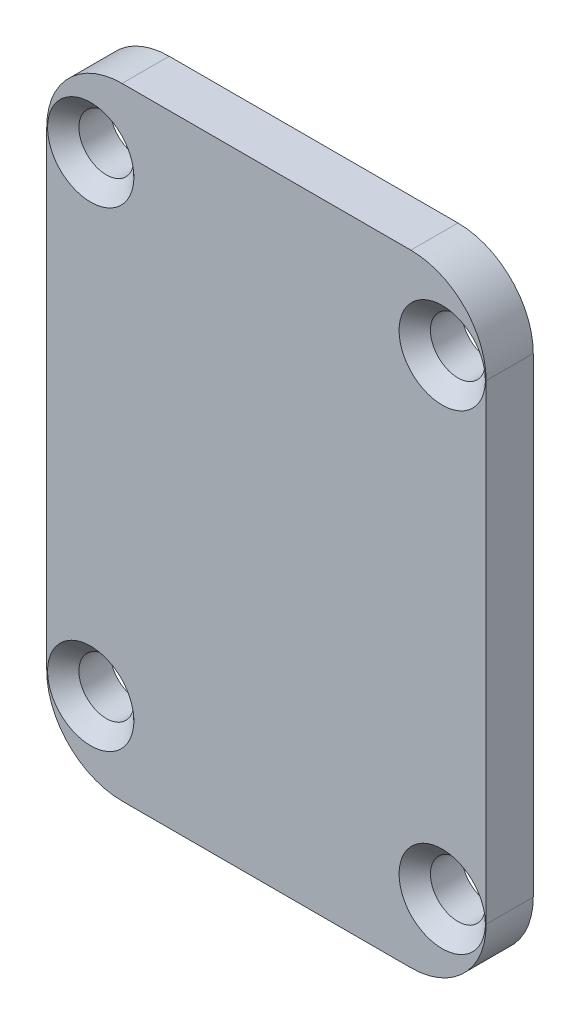
ISO-10303-21;
HEADER;
FILE_DESCRIPTION(('STEP AP214'),'2;1');
FILE_NAME('part.step','',(''),(''),'','','');
FILE_SCHEMA(('AUTOMOTIVE_DESIGN { 1 0 10303 214 1 1 1 1 }'));
ENDSEC;
DATA;
#1=APPLICATION_CONTEXT('core data for automotive mechanical design processes');
#2=APPLICATION_PROTOCOL_DEFINITION('international standard','automotive_design',2000,#1);
#3=PRODUCT_CONTEXT('',#1,'mechanical');
#4=PRODUCT('Part','Part','',(#3));
#5=PRODUCT_RELATED_PRODUCT_CATEGORY('part','',(#4));
#6=PRODUCT_DEFINITION_FORMATION('','',#4);
#7=PRODUCT_DEFINITION_CONTEXT('part definition',#1,'design');
#8=PRODUCT_DEFINITION('design','',#6,#7);
#9=PRODUCT_DEFINITION_SHAPE('','',#8);
#10=(LENGTH_UNIT() NAMED_UNIT(*) SI_UNIT(.MILLI.,.METRE.));
#11=(NAMED_UNIT(*) PLANE_ANGLE_UNIT() SI_UNIT($,.RADIAN.));
#12=(NAMED_UNIT(*) SI_UNIT($,.STERADIAN.) SOLID_ANGLE_UNIT());
#13=UNCERTAINTY_MEASURE_WITH_UNIT(LENGTH_MEASURE(1.E-05),#10,'distance_accuracy_value','');
#14=(GEOMETRIC_REPRESENTATION_CONTEXT(3) GLOBAL_UNCERTAINTY_ASSIGNED_CONTEXT((#13)) GLOBAL_UNIT_ASSIGNED_CONTEXT((#10,
#11,#12)) REPRESENTATION_CONTEXT('',''));
#15=CARTESIAN_POINT('',(0.,0.,0.));
#16=DIRECTION('',(0.,0.,1.));
#17=DIRECTION('',(1.,0.,0.));
#18=AXIS2_PLACEMENT_3D('',#15,#16,#17);
#19=CARTESIAN_POINT('',(0.,0.,3.));
#20=DIRECTION('',(0.,0.,-1.));
#21=DIRECTION('',(-1.,0.,0.));
#22=AXIS2_PLACEMENT_3D('',#19,#20,#21);
#23=PLANE('',#22);
#24=CARTESIAN_POINT('',(-11.2,15.,3.));
#25=DIRECTION('',(0.,0.,-1.));
#26=DIRECTION('',(-1.,0.,0.));
#27=AXIS2_PLACEMENT_3D('',#24,#25,#26);
#28=CIRCLE('',#27,2.75000000000001);
#29=CARTESIAN_POINT('',(-13.95,15.,3.));
#30=VERTEX_POINT('',#29);
#31=EDGE_CURVE('E192',#30,#30,#28,.T.);
#32=ORIENTED_EDGE('',*,*,#31,.T.);
#33=EDGE_LOOP('',(#32));
#34=FACE_BOUND('',#33,.T.);
#35=CARTESIAN_POINT('',(11.2,-15.,3.));
#36=DIRECTION('',(0.,0.,-1.));
#37=DIRECTION('',(-1.,0.,0.));
#38=AXIS2_PLACEMENT_3D('',#35,#36,#37);
#39=CIRCLE('',#38,2.75000000000001);
#40=CARTESIAN_POINT('',(8.44999999999999,-15.,3.));
#41=VERTEX_POINT('',#40);
#42=EDGE_CURVE('E195',#41,#41,#39,.T.);
#43=ORIENTED_EDGE('',*,*,#42,.T.);
#44=EDGE_LOOP('',(#43));
#45=FACE_BOUND('',#44,.T.);
#46=CARTESIAN_POINT('',(-11.2,-15.,3.));
#47=DIRECTION('',(0.,0.,-1.));
#48=DIRECTION('',(-1.,0.,0.));
#49=AXIS2_PLACEMENT_3D('',#46,#47,#48);
#50=CIRCLE('',#49,2.75000000000001);
#51=CARTESIAN_POINT('',(-13.95,-15.,3.));
#52=VERTEX_POINT('',#51);
#53=EDGE_CURVE('E198',#52,#52,#50,.T.);
#54=ORIENTED_EDGE('',*,*,#53,.T.);
#55=EDGE_LOOP('',(#54));
#56=FACE_BOUND('',#55,.T.);
#57=CARTESIAN_POINT('',(11.2,15.,3.));
#58=DIRECTION('',(0.,0.,-1.));
#59=DIRECTION('',(-1.,0.,0.));
#60=AXIS2_PLACEMENT_3D('',#57,#58,#59);
#61=CIRCLE('',#60,2.75000000000001);
#62=CARTESIAN_POINT('',(8.44999999999999,15.,3.));
#63=VERTEX_POINT('',#62);
#64=EDGE_CURVE('E201',#63,#63,#61,.T.);
#65=ORIENTED_EDGE('',*,*,#64,.T.);
#66=EDGE_LOOP('',(#65));
#67=FACE_BOUND('',#66,.T.);
#68=CARTESIAN_POINT('',(9.2,15.,3.));
#69=DIRECTION('',(0.,0.,1.));
#70=DIRECTION('',(1.,0.,0.));
#71=AXIS2_PLACEMENT_3D('',#68,#69,#70);
#72=CIRCLE('',#71,4.8);
#73=CARTESIAN_POINT('',(14.,15.,3.));
#74=VERTEX_POINT('',#73);
#75=CARTESIAN_POINT('',(9.2,19.8,3.));
#76=VERTEX_POINT('',#75);
#77=EDGE_CURVE('E146',#74,#76,#72,.T.);
#78=ORIENTED_EDGE('',*,*,#77,.T.);
#79=DIRECTION('',(-1.,0.,0.));
#80=VECTOR('',#79,1.);
#81=CARTESIAN_POINT('',(9.2,19.8,3.));
#82=LINE('',#81,#80);
#83=CARTESIAN_POINT('',(-9.2,19.8,3.));
#84=VERTEX_POINT('',#83);
#85=EDGE_CURVE('E149',#76,#84,#82,.T.);
#86=ORIENTED_EDGE('',*,*,#85,.T.);
#87=CARTESIAN_POINT('',(-9.2,15.,3.));
#88=DIRECTION('',(0.,0.,1.));
#89=DIRECTION('',(1.,0.,0.));
#90=AXIS2_PLACEMENT_3D('',#87,#88,#89);
#91=CIRCLE('',#90,4.8);
#92=CARTESIAN_POINT('',(-14.,15.,3.));
#93=VERTEX_POINT('',#92);
#94=EDGE_CURVE('E59',#84,#93,#91,.T.);
#95=ORIENTED_EDGE('',*,*,#94,.T.);
#96=DIRECTION('',(0.,-1.,0.));
#97=VECTOR('',#96,1.);
#98=CARTESIAN_POINT('',(-14.,15.,3.));
#99=LINE('',#98,#97);
#100=CARTESIAN_POINT('',(-14.,-15.,3.));
#101=VERTEX_POINT('',#100);
#102=EDGE_CURVE('E116',#93,#101,#99,.T.);
#103=ORIENTED_EDGE('',*,*,#102,.T.);
#104=CARTESIAN_POINT('',(-9.2,-15.,3.));
#105=DIRECTION('',(0.,0.,1.));
#106=DIRECTION('',(1.,0.,0.));
#107=AXIS2_PLACEMENT_3D('',#104,#105,#106);
#108=CIRCLE('',#107,4.8);
#109=CARTESIAN_POINT('',(-9.2,-19.8,3.));
#110=VERTEX_POINT('',#109);
#111=EDGE_CURVE('E154',#101,#110,#108,.T.);
#112=ORIENTED_EDGE('',*,*,#111,.T.);
#113=DIRECTION('',(1.,0.,0.));
#114=VECTOR('',#113,1.);
#115=CARTESIAN_POINT('',(-9.2,-19.8,3.));
#116=LINE('',#115,#114);
#117=CARTESIAN_POINT('',(9.2,-19.8,3.));
#118=VERTEX_POINT('',#117);
#119=EDGE_CURVE('E157',#110,#118,#116,.T.);
#120=ORIENTED_EDGE('',*,*,#119,.T.);
#121=CARTESIAN_POINT('',(9.2,-15.,3.));
#122=DIRECTION('',(0.,0.,1.));
#123=DIRECTION('',(1.,0.,0.));
#124=AXIS2_PLACEMENT_3D('',#121,#122,#123);
#125=CIRCLE('',#124,4.8);
#126=CARTESIAN_POINT('',(14.,-15.,3.));
#127=VERTEX_POINT('',#126);
#128=EDGE_CURVE('E160',#118,#127,#125,.T.);
#129=ORIENTED_EDGE('',*,*,#128,.T.);
#130=DIRECTION('',(0.,1.,0.));
#131=VECTOR('',#130,1.);
#132=CARTESIAN_POINT('',(14.,-15.,3.));
#133=LINE('',#132,#131);
#134=EDGE_CURVE('E163',#127,#74,#133,.T.);
#135=ORIENTED_EDGE('',*,*,#134,.T.);
#136=EDGE_LOOP('',(#78,#86,#95,#103,#112,#120,#129,#135));
#137=FACE_BOUND('',#136,.T.);
#138=ADVANCED_FACE('F43',(#34,#45,#56,#67,#137),#23,.F.);
#139=CARTESIAN_POINT('',(0.,0.,0.));
#140=DIRECTION('',(0.,0.,-1.));
#141=DIRECTION('',(-1.,0.,0.));
#142=AXIS2_PLACEMENT_3D('',#139,#140,#141);
#143=PLANE('',#142);
#144=CARTESIAN_POINT('',(-11.2,15.,0.));
#145=DIRECTION('',(0.,0.,1.));
#146=DIRECTION('',(1.,0.,0.));
#147=AXIS2_PLACEMENT_3D('',#144,#145,#146);
#148=CIRCLE('',#147,1.75);
#149=CARTESIAN_POINT('',(-9.45,15.,0.));
#150=VERTEX_POINT('',#149);
#151=EDGE_CURVE('E184',#150,#150,#148,.T.);
#152=ORIENTED_EDGE('',*,*,#151,.T.);
#153=EDGE_LOOP('',(#152));
#154=FACE_BOUND('',#153,.T.);
#155=CARTESIAN_POINT('',(11.2,-15.,0.));
#156=DIRECTION('',(0.,0.,1.));
#157=DIRECTION('',(1.,0.,0.));
#158=AXIS2_PLACEMENT_3D('',#155,#156,#157);
#159=CIRCLE('',#158,1.75);
#160=CARTESIAN_POINT('',(12.95,-15.,0.));
#161=VERTEX_POINT('',#160);
#162=EDGE_CURVE('E168',#161,#161,#159,.T.);
#163=ORIENTED_EDGE('',*,*,#162,.T.);
#164=EDGE_LOOP('',(#163));
#165=FACE_BOUND('',#164,.T.);
#166=CARTESIAN_POINT('',(-11.2,-15.,0.));
#167=DIRECTION('',(0.,0.,1.));
#168=DIRECTION('',(1.,0.,0.));
#169=AXIS2_PLACEMENT_3D('',#166,#167,#168);
#170=CIRCLE('',#169,1.75);
#171=CARTESIAN_POINT('',(-9.45,-15.,0.));
#172=VERTEX_POINT('',#171);
#173=EDGE_CURVE('E180',#172,#172,#170,.T.);
#174=ORIENTED_EDGE('',*,*,#173,.T.);
#175=EDGE_LOOP('',(#174));
#176=FACE_BOUND('',#175,.T.);
#177=CARTESIAN_POINT('',(11.2,15.,0.));
#178=DIRECTION('',(0.,0.,1.));
#179=DIRECTION('',(1.,0.,0.));
#180=AXIS2_PLACEMENT_3D('',#177,#178,#179);
#181=CIRCLE('',#180,1.75);
#182=CARTESIAN_POINT('',(12.95,15.,0.));
#183=VERTEX_POINT('',#182);
#184=EDGE_CURVE('E181',#183,#183,#181,.T.);
#185=ORIENTED_EDGE('',*,*,#184,.T.);
#186=EDGE_LOOP('',(#185));
#187=FACE_BOUND('',#186,.T.);
#188=DIRECTION('',(-1.,0.,0.));
#189=VECTOR('',#188,1.);
#190=CARTESIAN_POINT('',(9.2,19.8,0.));
#191=LINE('',#190,#189);
#192=CARTESIAN_POINT('',(9.2,19.8,0.));
#193=VERTEX_POINT('',#192);
#194=CARTESIAN_POINT('',(-9.2,19.8,0.));
#195=VERTEX_POINT('',#194);
#196=EDGE_CURVE('E126',#193,#195,#191,.T.);
#197=ORIENTED_EDGE('',*,*,#196,.F.);
#198=CARTESIAN_POINT('',(9.2,15.,0.));
#199=DIRECTION('',(0.,0.,1.));
#200=DIRECTION('',(1.,0.,0.));
#201=AXIS2_PLACEMENT_3D('',#198,#199,#200);
#202=CIRCLE('',#201,4.8);
#203=CARTESIAN_POINT('',(14.,15.,0.));
#204=VERTEX_POINT('',#203);
#205=EDGE_CURVE('E67',#204,#193,#202,.T.);
#206=ORIENTED_EDGE('',*,*,#205,.F.);
#207=DIRECTION('',(0.,1.,0.));
#208=VECTOR('',#207,1.);
#209=CARTESIAN_POINT('',(14.,-15.,0.));
#210=LINE('',#209,#208);
#211=CARTESIAN_POINT('',(14.,-15.,0.));
#212=VERTEX_POINT('',#211);
#213=EDGE_CURVE('E142',#212,#204,#210,.T.);
#214=ORIENTED_EDGE('',*,*,#213,.F.);
#215=CARTESIAN_POINT('',(9.2,-15.,0.));
#216=DIRECTION('',(0.,0.,1.));
#217=DIRECTION('',(1.,0.,0.));
#218=AXIS2_PLACEMENT_3D('',#215,#216,#217);
#219=CIRCLE('',#218,4.8);
#220=CARTESIAN_POINT('',(9.2,-19.8,0.));
#221=VERTEX_POINT('',#220);
#222=EDGE_CURVE('E139',#221,#212,#219,.T.);
#223=ORIENTED_EDGE('',*,*,#222,.F.);
#224=DIRECTION('',(1.,0.,0.));
#225=VECTOR('',#224,1.);
#226=CARTESIAN_POINT('',(-9.2,-19.8,0.));
#227=LINE('',#226,#225);
#228=CARTESIAN_POINT('',(-9.2,-19.8,0.));
#229=VERTEX_POINT('',#228);
#230=EDGE_CURVE('E133',#229,#221,#227,.T.);
#231=ORIENTED_EDGE('',*,*,#230,.F.);
#232=CARTESIAN_POINT('',(-9.2,-15.,0.));
#233=DIRECTION('',(0.,0.,1.));
#234=DIRECTION('',(1.,0.,0.));
#235=AXIS2_PLACEMENT_3D('',#232,#233,#234);
#236=CIRCLE('',#235,4.8);
#237=CARTESIAN_POINT('',(-14.,-15.,0.));
#238=VERTEX_POINT('',#237);
#239=EDGE_CURVE('E131',#238,#229,#236,.T.);
#240=ORIENTED_EDGE('',*,*,#239,.F.);
#241=DIRECTION('',(0.,-1.,0.));
#242=VECTOR('',#241,1.);
#243=CARTESIAN_POINT('',(-14.,15.,0.));
#244=LINE('',#243,#242);
#245=CARTESIAN_POINT('',(-14.,15.,0.));
#246=VERTEX_POINT('',#245);
#247=EDGE_CURVE('E113',#246,#238,#244,.T.);
#248=ORIENTED_EDGE('',*,*,#247,.F.);
#249=CARTESIAN_POINT('',(-9.2,15.,0.));
#250=DIRECTION('',(0.,0.,1.));
#251=DIRECTION('',(1.,0.,0.));
#252=AXIS2_PLACEMENT_3D('',#249,#250,#251);
#253=CIRCLE('',#252,4.8);
#254=EDGE_CURVE('E121',#195,#246,#253,.T.);
#255=ORIENTED_EDGE('',*,*,#254,.F.);
#256=EDGE_LOOP('',(#197,#206,#214,#223,#231,#240,#248,#255));
#257=FACE_BOUND('',#256,.T.);
#258=ADVANCED_FACE('F128',(#154,#165,#176,#187,#257),#143,.T.);
#259=CARTESIAN_POINT('',(-11.2,15.,0.));
#260=DIRECTION('',(0.,0.,1.));
#261=DIRECTION('',(1.,0.,0.));
#262=AXIS2_PLACEMENT_3D('',#259,#260,#261);
#263=CYLINDRICAL_SURFACE('',#262,1.75);
#264=CARTESIAN_POINT('',(-11.2,15.,1.99999999999999));
#265=DIRECTION('',(0.,0.,-1.));
#266=DIRECTION('',(-1.,0.,0.));
#267=AXIS2_PLACEMENT_3D('',#264,#265,#266);
#268=CIRCLE('',#267,1.75);
#269=CARTESIAN_POINT('',(-12.95,15.,1.99999999999999));
#270=VERTEX_POINT('',#269);
#271=EDGE_CURVE('E11',#270,#270,#268,.F.);
#272=ORIENTED_EDGE('',*,*,#271,.T.);
#273=EDGE_LOOP('',(#272));
#274=FACE_BOUND('',#273,.T.);
#275=ORIENTED_EDGE('',*,*,#151,.F.);
#276=EDGE_LOOP('',(#275));
#277=FACE_BOUND('',#276,.T.);
#278=ADVANCED_FACE('F233',(#274,#277),#263,.F.);
#279=CARTESIAN_POINT('',(11.2,-15.,0.));
#280=DIRECTION('',(0.,0.,1.));
#281=DIRECTION('',(1.,0.,0.));
#282=AXIS2_PLACEMENT_3D('',#279,#280,#281);
#283=CYLINDRICAL_SURFACE('',#282,1.75);
#284=CARTESIAN_POINT('',(11.2,-15.,1.99999999999999));
#285=DIRECTION('',(0.,0.,-1.));
#286=DIRECTION('',(-1.,0.,0.));
#287=AXIS2_PLACEMENT_3D('',#284,#285,#286);
#288=CIRCLE('',#287,1.75);
#289=CARTESIAN_POINT('',(9.45,-15.,1.99999999999999));
#290=VERTEX_POINT('',#289);
#291=EDGE_CURVE('E52',#290,#290,#288,.F.);
#292=ORIENTED_EDGE('',*,*,#291,.T.);
#293=EDGE_LOOP('',(#292));
#294=FACE_BOUND('',#293,.T.);
#295=ORIENTED_EDGE('',*,*,#162,.F.);
#296=EDGE_LOOP('',(#295));
#297=FACE_BOUND('',#296,.T.);
#298=ADVANCED_FACE('F209',(#294,#297),#283,.F.);
#299=CARTESIAN_POINT('',(-11.2,-15.,0.));
#300=DIRECTION('',(0.,0.,1.));
#301=DIRECTION('',(1.,0.,0.));
#302=AXIS2_PLACEMENT_3D('',#299,#300,#301);
#303=CYLINDRICAL_SURFACE('',#302,1.75);
#304=CARTESIAN_POINT('',(-11.2,-15.,1.99999999999999));
#305=DIRECTION('',(0.,0.,-1.));
#306=DIRECTION('',(-1.,0.,0.));
#307=AXIS2_PLACEMENT_3D('',#304,#305,#306);
#308=CIRCLE('',#307,1.75);
#309=CARTESIAN_POINT('',(-12.95,-15.,1.99999999999999));
#310=VERTEX_POINT('',#309);
#311=EDGE_CURVE('E204',#310,#310,#308,.F.);
#312=ORIENTED_EDGE('',*,*,#311,.T.);
#313=EDGE_LOOP('',(#312));
#314=FACE_BOUND('',#313,.T.);
#315=ORIENTED_EDGE('',*,*,#173,.F.);
#316=EDGE_LOOP('',(#315));
#317=FACE_BOUND('',#316,.T.);
#318=ADVANCED_FACE('F256',(#314,#317),#303,.F.);
#319=CARTESIAN_POINT('',(11.2,15.,0.));
#320=DIRECTION('',(0.,0.,1.));
#321=DIRECTION('',(1.,0.,0.));
#322=AXIS2_PLACEMENT_3D('',#319,#320,#321);
#323=CYLINDRICAL_SURFACE('',#322,1.75);
#324=CARTESIAN_POINT('',(11.2,15.,1.99999999999999));
#325=DIRECTION('',(0.,0.,-1.));
#326=DIRECTION('',(-1.,0.,0.));
#327=AXIS2_PLACEMENT_3D('',#324,#325,#326);
#328=CIRCLE('',#327,1.75);
#329=CARTESIAN_POINT('',(9.45,15.,1.99999999999999));
#330=VERTEX_POINT('',#329);
#331=EDGE_CURVE('E189',#330,#330,#328,.F.);
#332=ORIENTED_EDGE('',*,*,#331,.T.);
#333=EDGE_LOOP('',(#332));
#334=FACE_BOUND('',#333,.T.);
#335=ORIENTED_EDGE('',*,*,#184,.F.);
#336=EDGE_LOOP('',(#335));
#337=FACE_BOUND('',#336,.T.);
#338=ADVANCED_FACE('F245',(#334,#337),#323,.F.);
#339=CARTESIAN_POINT('',(11.2,15.,1.99999999999999));
#340=DIRECTION('',(0.,0.,1.));
#341=DIRECTION('',(1.,0.,0.));
#342=AXIS2_PLACEMENT_3D('',#339,#340,#341);
#343=CONICAL_SURFACE('',#342,1.75,0.785398163397449);
#344=ORIENTED_EDGE('',*,*,#64,.F.);
#345=EDGE_LOOP('',(#344));
#346=FACE_BOUND('',#345,.T.);
#347=ORIENTED_EDGE('',*,*,#331,.F.);
#348=EDGE_LOOP('',(#347));
#349=FACE_BOUND('',#348,.T.);
#350=ADVANCED_FACE('F222',(#346,#349),#343,.F.);
#351=CARTESIAN_POINT('',(-11.2,-15.,1.99999999999999));
#352=DIRECTION('',(0.,0.,1.));
#353=DIRECTION('',(1.,0.,0.));
#354=AXIS2_PLACEMENT_3D('',#351,#352,#353);
#355=CONICAL_SURFACE('',#354,1.75,0.785398163397449);
#356=ORIENTED_EDGE('',*,*,#53,.F.);
#357=EDGE_LOOP('',(#356));
#358=FACE_BOUND('',#357,.T.);
#359=ORIENTED_EDGE('',*,*,#311,.F.);
#360=EDGE_LOOP('',(#359));
#361=FACE_BOUND('',#360,.T.);
#362=ADVANCED_FACE('F214',(#358,#361),#355,.F.);
#363=CARTESIAN_POINT('',(11.2,-15.,1.99999999999999));
#364=DIRECTION('',(0.,0.,1.));
#365=DIRECTION('',(1.,0.,0.));
#366=AXIS2_PLACEMENT_3D('',#363,#364,#365);
#367=CONICAL_SURFACE('',#366,1.75,0.785398163397449);
#368=ORIENTED_EDGE('',*,*,#42,.F.);
#369=EDGE_LOOP('',(#368));
#370=FACE_BOUND('',#369,.T.);
#371=ORIENTED_EDGE('',*,*,#291,.F.);
#372=EDGE_LOOP('',(#371));
#373=FACE_BOUND('',#372,.T.);
#374=ADVANCED_FACE('F212',(#370,#373),#367,.F.);
#375=CARTESIAN_POINT('',(-11.2,15.,1.99999999999999));
#376=DIRECTION('',(0.,0.,1.));
#377=DIRECTION('',(1.,0.,0.));
#378=AXIS2_PLACEMENT_3D('',#375,#376,#377);
#379=CONICAL_SURFACE('',#378,1.75,0.785398163397449);
#380=ORIENTED_EDGE('',*,*,#31,.F.);
#381=EDGE_LOOP('',(#380));
#382=FACE_BOUND('',#381,.T.);
#383=ORIENTED_EDGE('',*,*,#271,.F.);
#384=EDGE_LOOP('',(#383));
#385=FACE_BOUND('',#384,.T.);
#386=ADVANCED_FACE('F46',(#382,#385),#379,.F.);
#387=CARTESIAN_POINT('',(9.2,15.,0.));
#388=DIRECTION('',(0.,0.,1.));
#389=DIRECTION('',(1.,0.,0.));
#390=AXIS2_PLACEMENT_3D('',#387,#388,#389);
#391=CYLINDRICAL_SURFACE('',#390,4.8);
#392=ORIENTED_EDGE('',*,*,#77,.F.);
#393=DIRECTION('',(0.,0.,1.));
#394=VECTOR('',#393,1.);
#395=CARTESIAN_POINT('',(14.,15.,0.));
#396=LINE('',#395,#394);
#397=EDGE_CURVE('E166',#204,#74,#396,.T.);
#398=ORIENTED_EDGE('',*,*,#397,.F.);
#399=ORIENTED_EDGE('',*,*,#205,.T.);
#400=DIRECTION('',(0.,0.,1.));
#401=VECTOR('',#400,1.);
#402=CARTESIAN_POINT('',(9.2,19.8,0.));
#403=LINE('',#402,#401);
#404=EDGE_CURVE('E145',#193,#76,#403,.T.);
#405=ORIENTED_EDGE('',*,*,#404,.T.);
#406=EDGE_LOOP('',(#392,#398,#399,#405));
#407=FACE_BOUND('',#406,.T.);
#408=ADVANCED_FACE('F220',(#407),#391,.T.);
#409=CARTESIAN_POINT('',(14.,-15.,0.));
#410=DIRECTION('',(1.,0.,0.));
#411=DIRECTION('',(0.,1.,0.));
#412=AXIS2_PLACEMENT_3D('',#409,#410,#411);
#413=PLANE('',#412);
#414=ORIENTED_EDGE('',*,*,#134,.F.);
#415=DIRECTION('',(0.,0.,1.));
#416=VECTOR('',#415,1.);
#417=CARTESIAN_POINT('',(14.,-15.,0.));
#418=LINE('',#417,#416);
#419=EDGE_CURVE('E169',#212,#127,#418,.T.);
#420=ORIENTED_EDGE('',*,*,#419,.F.);
#421=ORIENTED_EDGE('',*,*,#213,.T.);
#422=ORIENTED_EDGE('',*,*,#397,.T.);
#423=EDGE_LOOP('',(#414,#420,#421,#422));
#424=FACE_BOUND('',#423,.T.);
#425=ADVANCED_FACE('F276',(#424),#413,.T.);
#426=CARTESIAN_POINT('',(9.2,-15.,0.));
#427=DIRECTION('',(0.,0.,1.));
#428=DIRECTION('',(1.,0.,0.));
#429=AXIS2_PLACEMENT_3D('',#426,#427,#428);
#430=CYLINDRICAL_SURFACE('',#429,4.8);
#431=ORIENTED_EDGE('',*,*,#128,.F.);
#432=DIRECTION('',(0.,0.,1.));
#433=VECTOR('',#432,1.);
#434=CARTESIAN_POINT('',(9.2,-19.8,0.));
#435=LINE('',#434,#433);
#436=EDGE_CURVE('E171',#221,#118,#435,.T.);
#437=ORIENTED_EDGE('',*,*,#436,.F.);
#438=ORIENTED_EDGE('',*,*,#222,.T.);
#439=ORIENTED_EDGE('',*,*,#419,.T.);
#440=EDGE_LOOP('',(#431,#437,#438,#439));
#441=FACE_BOUND('',#440,.T.);
#442=ADVANCED_FACE('F279',(#441),#430,.T.);
#443=CARTESIAN_POINT('',(-9.2,-19.8,0.));
#444=DIRECTION('',(0.,-1.,0.));
#445=DIRECTION('',(1.,0.,0.));
#446=AXIS2_PLACEMENT_3D('',#443,#444,#445);
#447=PLANE('',#446);
#448=ORIENTED_EDGE('',*,*,#119,.F.);
#449=DIRECTION('',(0.,0.,1.));
#450=VECTOR('',#449,1.);
#451=CARTESIAN_POINT('',(-9.2,-19.8,0.));
#452=LINE('',#451,#450);
#453=EDGE_CURVE('E173',#229,#110,#452,.T.);
#454=ORIENTED_EDGE('',*,*,#453,.F.);
#455=ORIENTED_EDGE('',*,*,#230,.T.);
#456=ORIENTED_EDGE('',*,*,#436,.T.);
#457=EDGE_LOOP('',(#448,#454,#455,#456));
#458=FACE_BOUND('',#457,.T.);
#459=ADVANCED_FACE('F282',(#458),#447,.T.);
#460=CARTESIAN_POINT('',(-9.2,-15.,0.));
#461=DIRECTION('',(0.,0.,1.));
#462=DIRECTION('',(1.,0.,0.));
#463=AXIS2_PLACEMENT_3D('',#460,#461,#462);
#464=CYLINDRICAL_SURFACE('',#463,4.8);
#465=ORIENTED_EDGE('',*,*,#111,.F.);
#466=DIRECTION('',(0.,0.,1.));
#467=VECTOR('',#466,1.);
#468=CARTESIAN_POINT('',(-14.,-15.,0.));
#469=LINE('',#468,#467);
#470=EDGE_CURVE('E117',#238,#101,#469,.T.);
#471=ORIENTED_EDGE('',*,*,#470,.F.);
#472=ORIENTED_EDGE('',*,*,#239,.T.);
#473=ORIENTED_EDGE('',*,*,#453,.T.);
#474=EDGE_LOOP('',(#465,#471,#472,#473));
#475=FACE_BOUND('',#474,.T.);
#476=ADVANCED_FACE('F285',(#475),#464,.T.);
#477=CARTESIAN_POINT('',(-14.,15.,0.));
#478=DIRECTION('',(-1.,0.,0.));
#479=DIRECTION('',(0.,0.,1.));
#480=AXIS2_PLACEMENT_3D('',#477,#478,#479);
#481=PLANE('',#480);
#482=ORIENTED_EDGE('',*,*,#102,.F.);
#483=DIRECTION('',(0.,0.,1.));
#484=VECTOR('',#483,1.);
#485=CARTESIAN_POINT('',(-14.,15.,0.));
#486=LINE('',#485,#484);
#487=EDGE_CURVE('E109',#246,#93,#486,.T.);
#488=ORIENTED_EDGE('',*,*,#487,.F.);
#489=ORIENTED_EDGE('',*,*,#247,.T.);
#490=ORIENTED_EDGE('',*,*,#470,.T.);
#491=EDGE_LOOP('',(#482,#488,#489,#490));
#492=FACE_BOUND('',#491,.T.);
#493=ADVANCED_FACE('F111',(#492),#481,.T.);
#494=CARTESIAN_POINT('',(-9.2,15.,0.));
#495=DIRECTION('',(0.,0.,1.));
#496=DIRECTION('',(1.,0.,0.));
#497=AXIS2_PLACEMENT_3D('',#494,#495,#496);
#498=CYLINDRICAL_SURFACE('',#497,4.8);
#499=ORIENTED_EDGE('',*,*,#94,.F.);
#500=DIRECTION('',(0.,0.,1.));
#501=VECTOR('',#500,1.);
#502=CARTESIAN_POINT('',(-9.2,19.8,0.));
#503=LINE('',#502,#501);
#504=EDGE_CURVE('E118',#195,#84,#503,.T.);
#505=ORIENTED_EDGE('',*,*,#504,.F.);
#506=ORIENTED_EDGE('',*,*,#254,.T.);
#507=ORIENTED_EDGE('',*,*,#487,.T.);
#508=EDGE_LOOP('',(#499,#505,#506,#507));
#509=FACE_BOUND('',#508,.T.);
#510=ADVANCED_FACE('F122',(#509),#498,.T.);
#511=CARTESIAN_POINT('',(9.2,19.8,0.));
#512=DIRECTION('',(0.,1.,0.));
#513=DIRECTION('',(0.,0.,1.));
#514=AXIS2_PLACEMENT_3D('',#511,#512,#513);
#515=PLANE('',#514);
#516=ORIENTED_EDGE('',*,*,#85,.F.);
#517=ORIENTED_EDGE('',*,*,#404,.F.);
#518=ORIENTED_EDGE('',*,*,#196,.T.);
#519=ORIENTED_EDGE('',*,*,#504,.T.);
#520=EDGE_LOOP('',(#516,#517,#518,#519));
#521=FACE_BOUND('',#520,.T.);
#522=ADVANCED_FACE('F271',(#521),#515,.T.);
#523=CLOSED_SHELL('',(#138,#258,#278,#298,#318,#338,#350,#362,#374,#386,#408,#425,#442,#459,
#476,#493,#510,#522));
#524=MANIFOLD_SOLID_BREP('B2',#523);
#525=ADVANCED_BREP_SHAPE_REPRESENTATION('',(#18,#524),#14);
#526=SHAPE_DEFINITION_REPRESENTATION(#9,#525);
ENDSEC;
END-ISO-10303-21;
